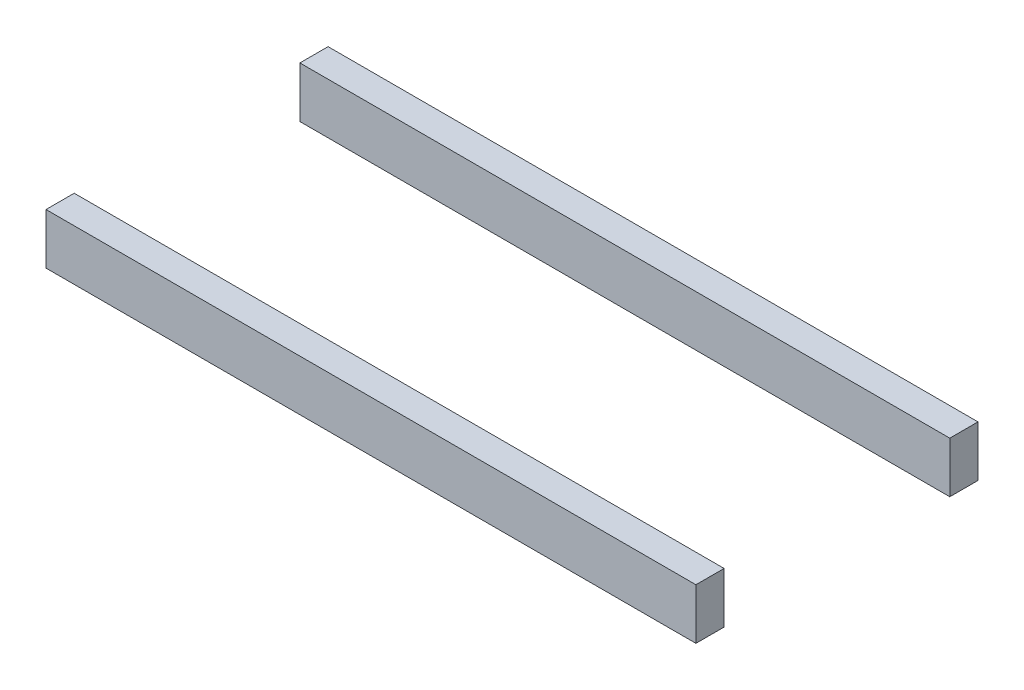
ISO-10303-21;
HEADER;
FILE_DESCRIPTION(('STEP AP214'),'2;1');
FILE_NAME('part.step','',(''),(''),'','','');
FILE_SCHEMA(('AUTOMOTIVE_DESIGN { 1 0 10303 214 1 1 1 1 }'));
ENDSEC;
DATA;
#1=APPLICATION_CONTEXT('core data for automotive mechanical design processes');
#2=APPLICATION_PROTOCOL_DEFINITION('international standard','automotive_design',2000,#1);
#3=PRODUCT_CONTEXT('',#1,'mechanical');
#4=PRODUCT('Part','Part','',(#3));
#5=PRODUCT_RELATED_PRODUCT_CATEGORY('part','',(#4));
#6=PRODUCT_DEFINITION_FORMATION('','',#4);
#7=PRODUCT_DEFINITION_CONTEXT('part definition',#1,'design');
#8=PRODUCT_DEFINITION('design','',#6,#7);
#9=PRODUCT_DEFINITION_SHAPE('','',#8);
#10=(LENGTH_UNIT() NAMED_UNIT(*) SI_UNIT(.MILLI.,.METRE.));
#11=(NAMED_UNIT(*) PLANE_ANGLE_UNIT() SI_UNIT($,.RADIAN.));
#12=(NAMED_UNIT(*) SI_UNIT($,.STERADIAN.) SOLID_ANGLE_UNIT());
#13=UNCERTAINTY_MEASURE_WITH_UNIT(LENGTH_MEASURE(1.E-05),#10,'distance_accuracy_value','');
#14=(GEOMETRIC_REPRESENTATION_CONTEXT(3) GLOBAL_UNCERTAINTY_ASSIGNED_CONTEXT((#13)) GLOBAL_UNIT_ASSIGNED_CONTEXT((#10,
#11,#12)) REPRESENTATION_CONTEXT('',''));
#15=CARTESIAN_POINT('',(0.,0.,0.));
#16=DIRECTION('',(0.,0.,1.));
#17=DIRECTION('',(1.,0.,0.));
#18=AXIS2_PLACEMENT_3D('',#15,#16,#17);
#19=CARTESIAN_POINT('',(27.5979557069847,-25.,-70.));
#20=DIRECTION('',(1.,0.,0.));
#21=DIRECTION('',(0.,0.,-1.));
#22=AXIS2_PLACEMENT_3D('',#19,#20,#21);
#23=PLANE('',#22);
#24=DIRECTION('',(0.,-1.,0.));
#25=VECTOR('',#24,1.);
#26=CARTESIAN_POINT('',(27.5979557069847,35.,-55.));
#27=LINE('',#26,#25);
#28=CARTESIAN_POINT('',(27.5979557069847,34.,-55.));
#29=VERTEX_POINT('',#28);
#30=CARTESIAN_POINT('',(27.5979557069847,25.,-55.));
#31=VERTEX_POINT('',#30);
#32=EDGE_CURVE('E84',#29,#31,#27,.T.);
#33=ORIENTED_EDGE('',*,*,#32,.T.);
#34=DIRECTION('',(0.,0.,1.));
#35=VECTOR('',#34,1.);
#36=CARTESIAN_POINT('',(27.5979557069847,25.,-60.));
#37=LINE('',#36,#35);
#38=CARTESIAN_POINT('',(27.5979557069847,25.,-60.));
#39=VERTEX_POINT('',#38);
#40=EDGE_CURVE('E12',#39,#31,#37,.T.);
#41=ORIENTED_EDGE('',*,*,#40,.F.);
#42=DIRECTION('',(0.,-1.,0.));
#43=VECTOR('',#42,1.);
#44=CARTESIAN_POINT('',(27.5979557069847,34.,-60.));
#45=LINE('',#44,#43);
#46=CARTESIAN_POINT('',(27.5979557069847,34.,-60.));
#47=VERTEX_POINT('',#46);
#48=EDGE_CURVE('E91',#47,#39,#45,.T.);
#49=ORIENTED_EDGE('',*,*,#48,.F.);
#50=DIRECTION('',(0.,0.,-1.));
#51=VECTOR('',#50,1.);
#52=CARTESIAN_POINT('',(27.5979557069847,34.,0.));
#53=LINE('',#52,#51);
#54=EDGE_CURVE('E104',#29,#47,#53,.T.);
#55=ORIENTED_EDGE('',*,*,#54,.F.);
#56=EDGE_LOOP('',(#33,#41,#49,#55));
#57=FACE_BOUND('',#56,.T.);
#58=ADVANCED_FACE('F42',(#57),#23,.T.);
#59=CARTESIAN_POINT('',(-87.5979557069847,0.,0.));
#60=DIRECTION('',(-1.,0.,0.));
#61=DIRECTION('',(0.,0.,1.));
#62=AXIS2_PLACEMENT_3D('',#59,#60,#61);
#63=PLANE('',#62);
#64=DIRECTION('',(0.,1.,0.));
#65=VECTOR('',#64,1.);
#66=CARTESIAN_POINT('',(-87.5979557069847,0.,-60.));
#67=LINE('',#66,#65);
#68=CARTESIAN_POINT('',(-87.5979557069847,25.,-60.));
#69=VERTEX_POINT('',#68);
#70=CARTESIAN_POINT('',(-87.5979557069847,34.,-60.));
#71=VERTEX_POINT('',#70);
#72=EDGE_CURVE('E88',#69,#71,#67,.T.);
#73=ORIENTED_EDGE('',*,*,#72,.F.);
#74=DIRECTION('',(0.,0.,1.));
#75=VECTOR('',#74,1.);
#76=CARTESIAN_POINT('',(-87.5979557069847,25.,0.));
#77=LINE('',#76,#75);
#78=CARTESIAN_POINT('',(-87.5979557069847,25.,-55.));
#79=VERTEX_POINT('',#78);
#80=EDGE_CURVE('E75',#69,#79,#77,.T.);
#81=ORIENTED_EDGE('',*,*,#80,.T.);
#82=DIRECTION('',(0.,1.,0.));
#83=VECTOR('',#82,1.);
#84=CARTESIAN_POINT('',(-87.5979557069847,25.,-55.));
#85=LINE('',#84,#83);
#86=CARTESIAN_POINT('',(-87.5979557069847,34.,-55.));
#87=VERTEX_POINT('',#86);
#88=EDGE_CURVE('E83',#79,#87,#85,.T.);
#89=ORIENTED_EDGE('',*,*,#88,.T.);
#90=DIRECTION('',(0.,0.,1.));
#91=VECTOR('',#90,1.);
#92=CARTESIAN_POINT('',(-87.5979557069847,34.,0.));
#93=LINE('',#92,#91);
#94=EDGE_CURVE('E92',#71,#87,#93,.T.);
#95=ORIENTED_EDGE('',*,*,#94,.F.);
#96=EDGE_LOOP('',(#73,#81,#89,#95));
#97=FACE_BOUND('',#96,.T.);
#98=ADVANCED_FACE('F95',(#97),#63,.T.);
#99=CARTESIAN_POINT('',(-112.597955706985,34.,-60.));
#100=DIRECTION('',(0.,0.,1.));
#101=DIRECTION('',(0.,-1.,0.));
#102=AXIS2_PLACEMENT_3D('',#99,#100,#101);
#103=PLANE('',#102);
#104=DIRECTION('',(1.,0.,0.));
#105=VECTOR('',#104,1.);
#106=CARTESIAN_POINT('',(27.5979557069847,25.,-60.));
#107=LINE('',#106,#105);
#108=EDGE_CURVE('E51',#69,#39,#107,.T.);
#109=ORIENTED_EDGE('',*,*,#108,.F.);
#110=ORIENTED_EDGE('',*,*,#72,.T.);
#111=DIRECTION('',(-1.,0.,0.));
#112=VECTOR('',#111,1.);
#113=CARTESIAN_POINT('',(-112.597955706985,34.,-60.));
#114=LINE('',#113,#112);
#115=EDGE_CURVE('E103',#47,#71,#114,.T.);
#116=ORIENTED_EDGE('',*,*,#115,.F.);
#117=ORIENTED_EDGE('',*,*,#48,.T.);
#118=EDGE_LOOP('',(#109,#110,#116,#117));
#119=FACE_BOUND('',#118,.T.);
#120=ADVANCED_FACE('F87',(#119),#103,.F.);
#121=CARTESIAN_POINT('',(27.5979557069847,35.,-55.));
#122=DIRECTION('',(0.,0.,-1.));
#123=DIRECTION('',(-1.,0.,0.));
#124=AXIS2_PLACEMENT_3D('',#121,#122,#123);
#125=PLANE('',#124);
#126=ORIENTED_EDGE('',*,*,#32,.F.);
#127=DIRECTION('',(-1.,0.,0.));
#128=VECTOR('',#127,1.);
#129=CARTESIAN_POINT('',(27.5979557069847,34.,-55.));
#130=LINE('',#129,#128);
#131=EDGE_CURVE('E97',#29,#87,#130,.T.);
#132=ORIENTED_EDGE('',*,*,#131,.T.);
#133=ORIENTED_EDGE('',*,*,#88,.F.);
#134=DIRECTION('',(1.,0.,0.));
#135=VECTOR('',#134,1.);
#136=CARTESIAN_POINT('',(27.5979557069847,25.,-55.));
#137=LINE('',#136,#135);
#138=EDGE_CURVE('E78',#79,#31,#137,.T.);
#139=ORIENTED_EDGE('',*,*,#138,.T.);
#140=EDGE_LOOP('',(#126,#132,#133,#139));
#141=FACE_BOUND('',#140,.T.);
#142=ADVANCED_FACE('F115',(#141),#125,.F.);
#143=CARTESIAN_POINT('',(-112.597955706985,34.,0.));
#144=DIRECTION('',(0.,-1.,0.));
#145=DIRECTION('',(0.,0.,-1.));
#146=AXIS2_PLACEMENT_3D('',#143,#144,#145);
#147=PLANE('',#146);
#148=ORIENTED_EDGE('',*,*,#54,.T.);
#149=ORIENTED_EDGE('',*,*,#115,.T.);
#150=ORIENTED_EDGE('',*,*,#94,.T.);
#151=ORIENTED_EDGE('',*,*,#131,.F.);
#152=EDGE_LOOP('',(#148,#149,#150,#151));
#153=FACE_BOUND('',#152,.T.);
#154=ADVANCED_FACE('F116',(#153),#147,.F.);
#155=CARTESIAN_POINT('',(0.,25.,0.));
#156=DIRECTION('',(0.,-1.,0.));
#157=DIRECTION('',(0.,0.,-1.));
#158=AXIS2_PLACEMENT_3D('',#155,#156,#157);
#159=PLANE('',#158);
#160=ORIENTED_EDGE('',*,*,#138,.F.);
#161=ORIENTED_EDGE('',*,*,#80,.F.);
#162=ORIENTED_EDGE('',*,*,#108,.T.);
#163=ORIENTED_EDGE('',*,*,#40,.T.);
#164=EDGE_LOOP('',(#160,#161,#162,#163));
#165=FACE_BOUND('',#164,.T.);
#166=ADVANCED_FACE('F44',(#165),#159,.T.);
#167=CLOSED_SHELL('',(#58,#98,#120,#142,#154,#166));
#168=MANIFOLD_SOLID_BREP('B2',#167);
#169=CARTESIAN_POINT('',(-112.597955706985,34.,0.));
#170=DIRECTION('',(0.,-1.,0.));
#171=DIRECTION('',(0.,0.,-1.));
#172=AXIS2_PLACEMENT_3D('',#169,#170,#171);
#173=PLANE('',#172);
#174=DIRECTION('',(0.,0.,1.));
#175=VECTOR('',#174,1.);
#176=CARTESIAN_POINT('',(-87.5979557069847,34.,0.));
#177=LINE('',#176,#175);
#178=CARTESIAN_POINT('',(-87.5979557069847,34.,-15.));
#179=VERTEX_POINT('',#178);
#180=CARTESIAN_POINT('',(-87.5979557069847,34.,-10.));
#181=VERTEX_POINT('',#180);
#182=EDGE_CURVE('E230',#179,#181,#177,.T.);
#183=ORIENTED_EDGE('',*,*,#182,.T.);
#184=DIRECTION('',(1.,0.,0.));
#185=VECTOR('',#184,1.);
#186=CARTESIAN_POINT('',(-112.597955706985,34.,-10.));
#187=LINE('',#186,#185);
#188=CARTESIAN_POINT('',(27.5979557069847,34.,-10.));
#189=VERTEX_POINT('',#188);
#190=EDGE_CURVE('E182',#181,#189,#187,.T.);
#191=ORIENTED_EDGE('',*,*,#190,.T.);
#192=DIRECTION('',(0.,0.,-1.));
#193=VECTOR('',#192,1.);
#194=CARTESIAN_POINT('',(27.5979557069847,34.,0.));
#195=LINE('',#194,#193);
#196=CARTESIAN_POINT('',(27.5979557069847,34.,-15.));
#197=VERTEX_POINT('',#196);
#198=EDGE_CURVE('E236',#189,#197,#195,.T.);
#199=ORIENTED_EDGE('',*,*,#198,.T.);
#200=DIRECTION('',(1.,0.,0.));
#201=VECTOR('',#200,1.);
#202=CARTESIAN_POINT('',(-27.5979557069847,34.,-15.));
#203=LINE('',#202,#201);
#204=EDGE_CURVE('E229',#179,#197,#203,.T.);
#205=ORIENTED_EDGE('',*,*,#204,.F.);
#206=EDGE_LOOP('',(#183,#191,#199,#205));
#207=FACE_BOUND('',#206,.T.);
#208=ADVANCED_FACE('F174',(#207),#173,.F.);
#209=CARTESIAN_POINT('',(-112.597955706985,34.,-10.));
#210=DIRECTION('',(0.,0.,-1.));
#211=DIRECTION('',(0.,1.,0.));
#212=AXIS2_PLACEMENT_3D('',#209,#210,#211);
#213=PLANE('',#212);
#214=DIRECTION('',(-1.,0.,0.));
#215=VECTOR('',#214,1.);
#216=CARTESIAN_POINT('',(-112.597955706985,25.,-10.));
#217=LINE('',#216,#215);
#218=CARTESIAN_POINT('',(27.5979557069847,25.,-10.));
#219=VERTEX_POINT('',#218);
#220=CARTESIAN_POINT('',(-87.5979557069847,25.,-10.));
#221=VERTEX_POINT('',#220);
#222=EDGE_CURVE('E40',#219,#221,#217,.T.);
#223=ORIENTED_EDGE('',*,*,#222,.F.);
#224=DIRECTION('',(0.,1.,0.));
#225=VECTOR('',#224,1.);
#226=CARTESIAN_POINT('',(27.5979557069847,34.,-10.));
#227=LINE('',#226,#225);
#228=EDGE_CURVE('E195',#219,#189,#227,.T.);
#229=ORIENTED_EDGE('',*,*,#228,.T.);
#230=ORIENTED_EDGE('',*,*,#190,.F.);
#231=DIRECTION('',(0.,-1.,0.));
#232=VECTOR('',#231,1.);
#233=CARTESIAN_POINT('',(-87.5979557069847,0.,-10.));
#234=LINE('',#233,#232);
#235=EDGE_CURVE('E240',#181,#221,#234,.T.);
#236=ORIENTED_EDGE('',*,*,#235,.T.);
#237=EDGE_LOOP('',(#223,#229,#230,#236));
#238=FACE_BOUND('',#237,.T.);
#239=ADVANCED_FACE('F247',(#238),#213,.F.);
#240=CARTESIAN_POINT('',(-87.5979557069847,0.,0.));
#241=DIRECTION('',(-1.,0.,0.));
#242=DIRECTION('',(0.,0.,1.));
#243=AXIS2_PLACEMENT_3D('',#240,#241,#242);
#244=PLANE('',#243);
#245=DIRECTION('',(0.,-1.,0.));
#246=VECTOR('',#245,1.);
#247=CARTESIAN_POINT('',(-87.5979557069847,35.,-15.));
#248=LINE('',#247,#246);
#249=CARTESIAN_POINT('',(-87.5979557069847,25.,-15.));
#250=VERTEX_POINT('',#249);
#251=EDGE_CURVE('E221',#179,#250,#248,.T.);
#252=ORIENTED_EDGE('',*,*,#251,.T.);
#253=DIRECTION('',(0.,0.,1.));
#254=VECTOR('',#253,1.);
#255=CARTESIAN_POINT('',(-87.5979557069847,25.,0.));
#256=LINE('',#255,#254);
#257=EDGE_CURVE('E215',#250,#221,#256,.T.);
#258=ORIENTED_EDGE('',*,*,#257,.T.);
#259=ORIENTED_EDGE('',*,*,#235,.F.);
#260=ORIENTED_EDGE('',*,*,#182,.F.);
#261=EDGE_LOOP('',(#252,#258,#259,#260));
#262=FACE_BOUND('',#261,.T.);
#263=ADVANCED_FACE('F246',(#262),#244,.T.);
#264=CARTESIAN_POINT('',(-27.5979557069847,35.,-15.));
#265=DIRECTION('',(0.,0.,1.));
#266=DIRECTION('',(1.,0.,0.));
#267=AXIS2_PLACEMENT_3D('',#264,#265,#266);
#268=PLANE('',#267);
#269=ORIENTED_EDGE('',*,*,#251,.F.);
#270=ORIENTED_EDGE('',*,*,#204,.T.);
#271=DIRECTION('',(0.,-1.,0.));
#272=VECTOR('',#271,1.);
#273=CARTESIAN_POINT('',(27.5979557069847,35.,-15.));
#274=LINE('',#273,#272);
#275=CARTESIAN_POINT('',(27.5979557069847,25.,-15.));
#276=VERTEX_POINT('',#275);
#277=EDGE_CURVE('E220',#197,#276,#274,.T.);
#278=ORIENTED_EDGE('',*,*,#277,.T.);
#279=DIRECTION('',(-1.,0.,0.));
#280=VECTOR('',#279,1.);
#281=CARTESIAN_POINT('',(-27.5979557069847,25.,-15.));
#282=LINE('',#281,#280);
#283=EDGE_CURVE('E212',#276,#250,#282,.T.);
#284=ORIENTED_EDGE('',*,*,#283,.T.);
#285=EDGE_LOOP('',(#269,#270,#278,#284));
#286=FACE_BOUND('',#285,.T.);
#287=ADVANCED_FACE('F228',(#286),#268,.F.);
#288=CARTESIAN_POINT('',(27.5979557069847,-25.,-70.));
#289=DIRECTION('',(1.,0.,0.));
#290=DIRECTION('',(0.,0.,-1.));
#291=AXIS2_PLACEMENT_3D('',#288,#289,#290);
#292=PLANE('',#291);
#293=ORIENTED_EDGE('',*,*,#228,.F.);
#294=DIRECTION('',(0.,0.,1.));
#295=VECTOR('',#294,1.);
#296=CARTESIAN_POINT('',(27.5979557069847,25.,-60.));
#297=LINE('',#296,#295);
#298=EDGE_CURVE('E188',#276,#219,#297,.T.);
#299=ORIENTED_EDGE('',*,*,#298,.F.);
#300=ORIENTED_EDGE('',*,*,#277,.F.);
#301=ORIENTED_EDGE('',*,*,#198,.F.);
#302=EDGE_LOOP('',(#293,#299,#300,#301));
#303=FACE_BOUND('',#302,.T.);
#304=ADVANCED_FACE('F176',(#303),#292,.T.);
#305=CARTESIAN_POINT('',(0.,25.,0.));
#306=DIRECTION('',(0.,-1.,0.));
#307=DIRECTION('',(0.,0.,-1.));
#308=AXIS2_PLACEMENT_3D('',#305,#306,#307);
#309=PLANE('',#308);
#310=ORIENTED_EDGE('',*,*,#283,.F.);
#311=ORIENTED_EDGE('',*,*,#298,.T.);
#312=ORIENTED_EDGE('',*,*,#222,.T.);
#313=ORIENTED_EDGE('',*,*,#257,.F.);
#314=EDGE_LOOP('',(#310,#311,#312,#313));
#315=FACE_BOUND('',#314,.T.);
#316=ADVANCED_FACE('F213',(#315),#309,.T.);
#317=CLOSED_SHELL('',(#208,#239,#263,#287,#304,#316));
#318=MANIFOLD_SOLID_BREP('B6',#317);
#319=ADVANCED_BREP_SHAPE_REPRESENTATION('',(#18,#168,#318),#14);
#320=SHAPE_DEFINITION_REPRESENTATION(#9,#319);
ENDSEC;
END-ISO-10303-21;
